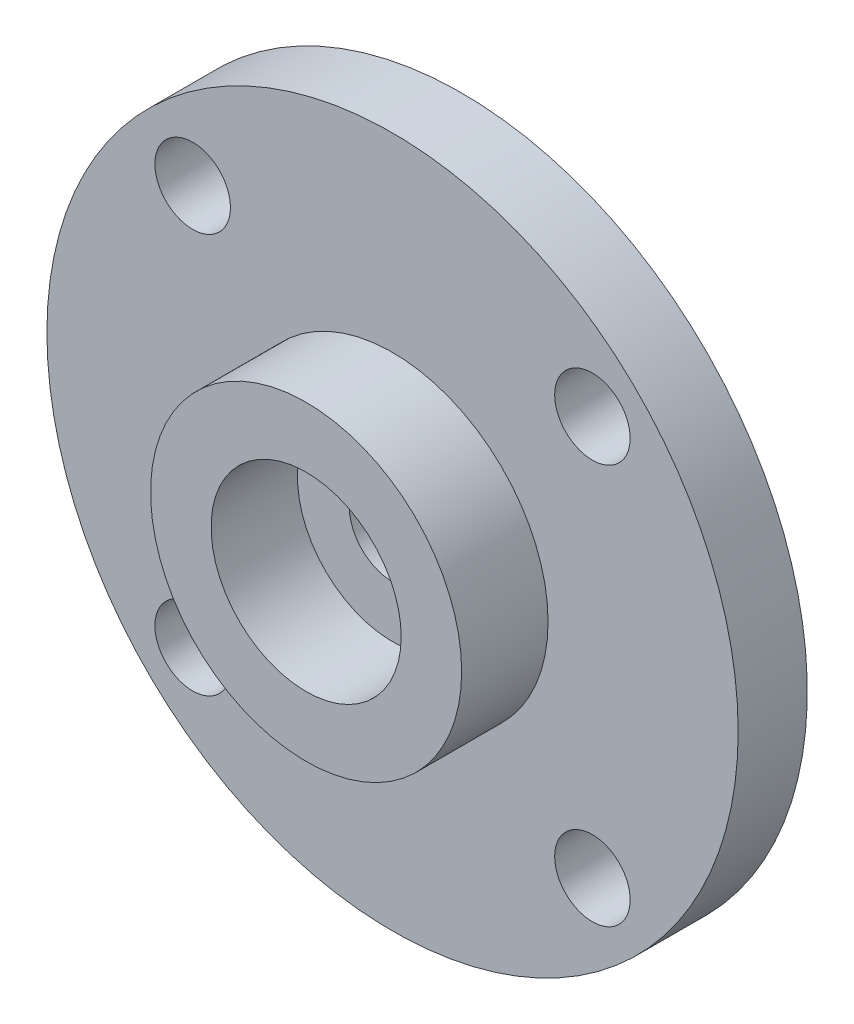
ISO-10303-21;
HEADER;
FILE_DESCRIPTION(('STEP AP214'),'2;1');
FILE_NAME('part.step','',(''),(''),'','','');
FILE_SCHEMA(('AUTOMOTIVE_DESIGN { 1 0 10303 214 1 1 1 1 }'));
ENDSEC;
DATA;
#1=APPLICATION_CONTEXT('core data for automotive mechanical design processes');
#2=APPLICATION_PROTOCOL_DEFINITION('international standard','automotive_design',2000,#1);
#3=PRODUCT_CONTEXT('',#1,'mechanical');
#4=PRODUCT('Part','Part','',(#3));
#5=PRODUCT_RELATED_PRODUCT_CATEGORY('part','',(#4));
#6=PRODUCT_DEFINITION_FORMATION('','',#4);
#7=PRODUCT_DEFINITION_CONTEXT('part definition',#1,'design');
#8=PRODUCT_DEFINITION('design','',#6,#7);
#9=PRODUCT_DEFINITION_SHAPE('','',#8);
#10=(LENGTH_UNIT() NAMED_UNIT(*) SI_UNIT(.MILLI.,.METRE.));
#11=(NAMED_UNIT(*) PLANE_ANGLE_UNIT() SI_UNIT($,.RADIAN.));
#12=(NAMED_UNIT(*) SI_UNIT($,.STERADIAN.) SOLID_ANGLE_UNIT());
#13=UNCERTAINTY_MEASURE_WITH_UNIT(LENGTH_MEASURE(1.E-05),#10,'distance_accuracy_value','');
#14=(GEOMETRIC_REPRESENTATION_CONTEXT(3) GLOBAL_UNCERTAINTY_ASSIGNED_CONTEXT((#13)) GLOBAL_UNIT_ASSIGNED_CONTEXT((#10,
#11,#12)) REPRESENTATION_CONTEXT('',''));
#15=CARTESIAN_POINT('',(0.,0.,0.));
#16=DIRECTION('',(0.,0.,1.));
#17=DIRECTION('',(1.,0.,0.));
#18=AXIS2_PLACEMENT_3D('',#15,#16,#17);
#19=CARTESIAN_POINT('',(0.,0.,0.));
#20=DIRECTION('',(0.,0.,1.));
#21=DIRECTION('',(1.,0.,0.));
#22=AXIS2_PLACEMENT_3D('',#19,#20,#21);
#23=PLANE('',#22);
#24=CARTESIAN_POINT('',(0.,0.,0.));
#25=DIRECTION('',(0.,0.,1.));
#26=DIRECTION('',(-1.,0.,0.));
#27=AXIS2_PLACEMENT_3D('',#24,#25,#26);
#28=CIRCLE('',#27,3.75);
#29=CARTESIAN_POINT('',(-3.75,0.,0.));
#30=VERTEX_POINT('',#29);
#31=EDGE_CURVE('E122',#30,#30,#28,.T.);
#32=ORIENTED_EDGE('',*,*,#31,.T.);
#33=EDGE_LOOP('',(#32));
#34=FACE_BOUND('',#33,.T.);
#35=CARTESIAN_POINT('',(-5.7828,5.7828,0.));
#36=DIRECTION('',(0.,0.,1.));
#37=DIRECTION('',(1.,0.,0.));
#38=AXIS2_PLACEMENT_3D('',#35,#36,#37);
#39=CIRCLE('',#38,1.0922);
#40=CARTESIAN_POINT('',(-6.875,5.7828,0.));
#41=VERTEX_POINT('',#40);
#42=EDGE_CURVE('E114',#41,#41,#39,.T.);
#43=ORIENTED_EDGE('',*,*,#42,.T.);
#44=EDGE_LOOP('',(#43));
#45=FACE_BOUND('',#44,.T.);
#46=CARTESIAN_POINT('',(5.7828,-5.7828,0.));
#47=DIRECTION('',(0.,0.,1.));
#48=DIRECTION('',(1.,0.,0.));
#49=AXIS2_PLACEMENT_3D('',#46,#47,#48);
#50=CIRCLE('',#49,1.0922);
#51=CARTESIAN_POINT('',(4.6906,-5.7828,0.));
#52=VERTEX_POINT('',#51);
#53=EDGE_CURVE('E104',#52,#52,#50,.T.);
#54=ORIENTED_EDGE('',*,*,#53,.T.);
#55=EDGE_LOOP('',(#54));
#56=FACE_BOUND('',#55,.T.);
#57=CARTESIAN_POINT('',(-5.7828,-5.7828,0.));
#58=DIRECTION('',(0.,0.,1.));
#59=DIRECTION('',(1.,0.,0.));
#60=AXIS2_PLACEMENT_3D('',#57,#58,#59);
#61=CIRCLE('',#60,1.0922);
#62=CARTESIAN_POINT('',(-6.875,-5.7828,0.));
#63=VERTEX_POINT('',#62);
#64=EDGE_CURVE('E98',#63,#63,#61,.T.);
#65=ORIENTED_EDGE('',*,*,#64,.T.);
#66=EDGE_LOOP('',(#65));
#67=FACE_BOUND('',#66,.T.);
#68=CARTESIAN_POINT('',(5.7828,5.7828,0.));
#69=DIRECTION('',(0.,0.,1.));
#70=DIRECTION('',(1.,0.,0.));
#71=AXIS2_PLACEMENT_3D('',#68,#69,#70);
#72=CIRCLE('',#71,1.0922);
#73=CARTESIAN_POINT('',(4.6906,5.7828,0.));
#74=VERTEX_POINT('',#73);
#75=EDGE_CURVE('E106',#74,#74,#72,.T.);
#76=ORIENTED_EDGE('',*,*,#75,.T.);
#77=EDGE_LOOP('',(#76));
#78=FACE_BOUND('',#77,.T.);
#79=CARTESIAN_POINT('',(0.,0.,0.));
#80=DIRECTION('',(0.,0.,-1.));
#81=DIRECTION('',(-1.,0.,0.));
#82=AXIS2_PLACEMENT_3D('',#79,#80,#81);
#83=CIRCLE('',#82,10.);
#84=CARTESIAN_POINT('',(-10.,0.,0.));
#85=VERTEX_POINT('',#84);
#86=EDGE_CURVE('E186',#85,#85,#83,.T.);
#87=ORIENTED_EDGE('',*,*,#86,.T.);
#88=EDGE_LOOP('',(#87));
#89=FACE_BOUND('',#88,.T.);
#90=ADVANCED_FACE('F36',(#34,#45,#56,#67,#78,#89),#23,.F.);
#91=CARTESIAN_POINT('',(0.,0.,2.));
#92=DIRECTION('',(0.,0.,1.));
#93=DIRECTION('',(1.,0.,0.));
#94=AXIS2_PLACEMENT_3D('',#91,#92,#93);
#95=PLANE('',#94);
#96=CARTESIAN_POINT('',(0.,0.,2.));
#97=DIRECTION('',(0.,0.,-1.));
#98=DIRECTION('',(1.,0.,0.));
#99=AXIS2_PLACEMENT_3D('',#96,#97,#98);
#100=CIRCLE('',#99,4.5);
#101=CARTESIAN_POINT('',(4.5,0.,2.));
#102=VERTEX_POINT('',#101);
#103=EDGE_CURVE('E110',#102,#102,#100,.T.);
#104=ORIENTED_EDGE('',*,*,#103,.T.);
#105=EDGE_LOOP('',(#104));
#106=FACE_BOUND('',#105,.T.);
#107=CARTESIAN_POINT('',(-5.7828,5.7828,2.));
#108=DIRECTION('',(0.,0.,-1.));
#109=DIRECTION('',(1.,0.,0.));
#110=AXIS2_PLACEMENT_3D('',#107,#108,#109);
#111=CIRCLE('',#110,1.0922);
#112=CARTESIAN_POINT('',(-6.875,5.7828,2.));
#113=VERTEX_POINT('',#112);
#114=EDGE_CURVE('E112',#113,#113,#111,.T.);
#115=ORIENTED_EDGE('',*,*,#114,.T.);
#116=EDGE_LOOP('',(#115));
#117=FACE_BOUND('',#116,.T.);
#118=CARTESIAN_POINT('',(5.7828,-5.7828,2.));
#119=DIRECTION('',(0.,0.,-1.));
#120=DIRECTION('',(1.,0.,0.));
#121=AXIS2_PLACEMENT_3D('',#118,#119,#120);
#122=CIRCLE('',#121,1.0922);
#123=CARTESIAN_POINT('',(4.6906,-5.7828,2.));
#124=VERTEX_POINT('',#123);
#125=EDGE_CURVE('E115',#124,#124,#122,.T.);
#126=ORIENTED_EDGE('',*,*,#125,.T.);
#127=EDGE_LOOP('',(#126));
#128=FACE_BOUND('',#127,.T.);
#129=CARTESIAN_POINT('',(-5.7828,-5.7828,2.));
#130=DIRECTION('',(0.,0.,-1.));
#131=DIRECTION('',(1.,0.,0.));
#132=AXIS2_PLACEMENT_3D('',#129,#130,#131);
#133=CIRCLE('',#132,1.0922);
#134=CARTESIAN_POINT('',(-6.875,-5.7828,2.));
#135=VERTEX_POINT('',#134);
#136=EDGE_CURVE('E101',#135,#135,#133,.T.);
#137=ORIENTED_EDGE('',*,*,#136,.T.);
#138=EDGE_LOOP('',(#137));
#139=FACE_BOUND('',#138,.T.);
#140=CARTESIAN_POINT('',(5.7828,5.7828,2.));
#141=DIRECTION('',(0.,0.,-1.));
#142=DIRECTION('',(1.,0.,0.));
#143=AXIS2_PLACEMENT_3D('',#140,#141,#142);
#144=CIRCLE('',#143,1.0922);
#145=CARTESIAN_POINT('',(4.6906,5.7828,2.));
#146=VERTEX_POINT('',#145);
#147=EDGE_CURVE('E102',#146,#146,#144,.T.);
#148=ORIENTED_EDGE('',*,*,#147,.T.);
#149=EDGE_LOOP('',(#148));
#150=FACE_BOUND('',#149,.T.);
#151=CARTESIAN_POINT('',(0.,0.,2.));
#152=DIRECTION('',(0.,0.,1.));
#153=DIRECTION('',(1.,0.,0.));
#154=AXIS2_PLACEMENT_3D('',#151,#152,#153);
#155=CIRCLE('',#154,10.);
#156=CARTESIAN_POINT('',(10.,0.,2.));
#157=VERTEX_POINT('',#156);
#158=EDGE_CURVE('E40',#157,#157,#155,.T.);
#159=ORIENTED_EDGE('',*,*,#158,.T.);
#160=EDGE_LOOP('',(#159));
#161=FACE_BOUND('',#160,.T.);
#162=ADVANCED_FACE('F156',(#106,#117,#128,#139,#150,#161),#95,.T.);
#163=CARTESIAN_POINT('',(0.,0.,4.5));
#164=DIRECTION('',(0.,0.,1.));
#165=DIRECTION('',(1.,0.,0.));
#166=AXIS2_PLACEMENT_3D('',#163,#164,#165);
#167=PLANE('',#166);
#168=CARTESIAN_POINT('',(0.,0.,4.5));
#169=DIRECTION('',(0.,0.,-1.));
#170=DIRECTION('',(1.,0.,0.));
#171=AXIS2_PLACEMENT_3D('',#168,#169,#170);
#172=CIRCLE('',#171,4.5);
#173=CARTESIAN_POINT('',(4.5,0.,4.5));
#174=VERTEX_POINT('',#173);
#175=EDGE_CURVE('E11',#174,#174,#172,.T.);
#176=ORIENTED_EDGE('',*,*,#175,.F.);
#177=EDGE_LOOP('',(#176));
#178=FACE_BOUND('',#177,.T.);
#179=CARTESIAN_POINT('',(0.,0.,4.5));
#180=DIRECTION('',(0.,0.,-1.));
#181=DIRECTION('',(1.,0.,0.));
#182=AXIS2_PLACEMENT_3D('',#179,#180,#181);
#183=CIRCLE('',#182,2.75);
#184=CARTESIAN_POINT('',(2.75,0.,4.5));
#185=VERTEX_POINT('',#184);
#186=EDGE_CURVE('E46',#185,#185,#183,.T.);
#187=ORIENTED_EDGE('',*,*,#186,.T.);
#188=EDGE_LOOP('',(#187));
#189=FACE_BOUND('',#188,.T.);
#190=ADVANCED_FACE('F162',(#178,#189),#167,.T.);
#191=CARTESIAN_POINT('',(0.,0.,2.));
#192=DIRECTION('',(0.,0.,1.));
#193=DIRECTION('',(1.,0.,0.));
#194=AXIS2_PLACEMENT_3D('',#191,#192,#193);
#195=CYLINDRICAL_SURFACE('',#194,4.5);
#196=ORIENTED_EDGE('',*,*,#103,.F.);
#197=EDGE_LOOP('',(#196));
#198=FACE_BOUND('',#197,.T.);
#199=ORIENTED_EDGE('',*,*,#175,.T.);
#200=EDGE_LOOP('',(#199));
#201=FACE_BOUND('',#200,.T.);
#202=ADVANCED_FACE('F206',(#198,#201),#195,.T.);
#203=CARTESIAN_POINT('',(0.,0.,2.));
#204=DIRECTION('',(0.,0.,1.));
#205=DIRECTION('',(1.,0.,0.));
#206=AXIS2_PLACEMENT_3D('',#203,#204,#205);
#207=PLANE('',#206);
#208=CARTESIAN_POINT('',(0.,0.,2.));
#209=DIRECTION('',(0.,0.,1.));
#210=DIRECTION('',(1.,0.,0.));
#211=AXIS2_PLACEMENT_3D('',#208,#209,#210);
#212=CIRCLE('',#211,2.75);
#213=CARTESIAN_POINT('',(2.75,0.,2.));
#214=VERTEX_POINT('',#213);
#215=EDGE_CURVE('E130',#214,#214,#212,.T.);
#216=ORIENTED_EDGE('',*,*,#215,.T.);
#217=EDGE_LOOP('',(#216));
#218=FACE_BOUND('',#217,.T.);
#219=CARTESIAN_POINT('',(0.,0.,2.));
#220=DIRECTION('',(0.,0.,-1.));
#221=DIRECTION('',(1.,0.,0.));
#222=AXIS2_PLACEMENT_3D('',#219,#220,#221);
#223=CIRCLE('',#222,1.25);
#224=CARTESIAN_POINT('',(-1.25,0.,2.));
#225=VERTEX_POINT('',#224);
#226=EDGE_CURVE('E119',#225,#225,#223,.T.);
#227=ORIENTED_EDGE('',*,*,#226,.T.);
#228=EDGE_LOOP('',(#227));
#229=FACE_BOUND('',#228,.T.);
#230=ADVANCED_FACE('F209',(#218,#229),#207,.T.);
#231=CARTESIAN_POINT('',(0.,0.,4.5));
#232=DIRECTION('',(0.,0.,-1.));
#233=DIRECTION('',(1.,0.,0.));
#234=AXIS2_PLACEMENT_3D('',#231,#232,#233);
#235=CYLINDRICAL_SURFACE('',#234,2.75);
#236=ORIENTED_EDGE('',*,*,#186,.F.);
#237=EDGE_LOOP('',(#236));
#238=FACE_BOUND('',#237,.T.);
#239=ORIENTED_EDGE('',*,*,#215,.F.);
#240=EDGE_LOOP('',(#239));
#241=FACE_BOUND('',#240,.T.);
#242=ADVANCED_FACE('F200',(#238,#241),#235,.F.);
#243=CARTESIAN_POINT('',(0.,0.,0.));
#244=DIRECTION('',(0.,0.,1.));
#245=DIRECTION('',(1.,0.,0.));
#246=AXIS2_PLACEMENT_3D('',#243,#244,#245);
#247=PLANE('',#246);
#248=CARTESIAN_POINT('',(0.,0.,0.));
#249=DIRECTION('',(0.,0.,-1.));
#250=DIRECTION('',(-1.,0.,0.));
#251=AXIS2_PLACEMENT_3D('',#248,#249,#250);
#252=CIRCLE('',#251,3.);
#253=CARTESIAN_POINT('',(-3.,0.,0.));
#254=VERTEX_POINT('',#253);
#255=EDGE_CURVE('E128',#254,#254,#252,.T.);
#256=ORIENTED_EDGE('',*,*,#255,.T.);
#257=EDGE_LOOP('',(#256));
#258=FACE_BOUND('',#257,.T.);
#259=CARTESIAN_POINT('',(0.,0.,0.));
#260=DIRECTION('',(0.,0.,1.));
#261=DIRECTION('',(1.,0.,0.));
#262=AXIS2_PLACEMENT_3D('',#259,#260,#261);
#263=CIRCLE('',#262,1.25);
#264=CARTESIAN_POINT('',(-1.25,0.,0.));
#265=VERTEX_POINT('',#264);
#266=EDGE_CURVE('E117',#265,#265,#263,.T.);
#267=ORIENTED_EDGE('',*,*,#266,.T.);
#268=EDGE_LOOP('',(#267));
#269=FACE_BOUND('',#268,.T.);
#270=ADVANCED_FACE('F38',(#258,#269),#247,.F.);
#271=CARTESIAN_POINT('',(0.,0.,-0.5));
#272=DIRECTION('',(0.,0.,-1.));
#273=DIRECTION('',(0.,-1.,0.));
#274=AXIS2_PLACEMENT_3D('',#271,#272,#273);
#275=PLANE('',#274);
#276=CARTESIAN_POINT('',(0.,0.,-0.5));
#277=DIRECTION('',(0.,0.,1.));
#278=DIRECTION('',(-1.,0.,0.));
#279=AXIS2_PLACEMENT_3D('',#276,#277,#278);
#280=CIRCLE('',#279,3.75);
#281=CARTESIAN_POINT('',(-3.75,0.,-0.5));
#282=VERTEX_POINT('',#281);
#283=EDGE_CURVE('E118',#282,#282,#280,.T.);
#284=ORIENTED_EDGE('',*,*,#283,.F.);
#285=EDGE_LOOP('',(#284));
#286=FACE_BOUND('',#285,.T.);
#287=CARTESIAN_POINT('',(0.,0.,-0.5));
#288=DIRECTION('',(0.,0.,-1.));
#289=DIRECTION('',(-1.,0.,0.));
#290=AXIS2_PLACEMENT_3D('',#287,#288,#289);
#291=CIRCLE('',#290,3.);
#292=CARTESIAN_POINT('',(-3.,0.,-0.5));
#293=VERTEX_POINT('',#292);
#294=EDGE_CURVE('E127',#293,#293,#291,.T.);
#295=ORIENTED_EDGE('',*,*,#294,.F.);
#296=EDGE_LOOP('',(#295));
#297=FACE_BOUND('',#296,.T.);
#298=ADVANCED_FACE('F191',(#286,#297),#275,.T.);
#299=CARTESIAN_POINT('',(0.,0.,0.));
#300=DIRECTION('',(0.,0.,-1.));
#301=DIRECTION('',(-1.,0.,0.));
#302=AXIS2_PLACEMENT_3D('',#299,#300,#301);
#303=CYLINDRICAL_SURFACE('',#302,3.);
#304=ORIENTED_EDGE('',*,*,#255,.F.);
#305=EDGE_LOOP('',(#304));
#306=FACE_BOUND('',#305,.T.);
#307=ORIENTED_EDGE('',*,*,#294,.T.);
#308=EDGE_LOOP('',(#307));
#309=FACE_BOUND('',#308,.T.);
#310=ADVANCED_FACE('F167',(#306,#309),#303,.F.);
#311=CARTESIAN_POINT('',(0.,0.,0.));
#312=DIRECTION('',(0.,0.,-1.));
#313=DIRECTION('',(-1.,0.,0.));
#314=AXIS2_PLACEMENT_3D('',#311,#312,#313);
#315=CYLINDRICAL_SURFACE('',#314,3.75);
#316=ORIENTED_EDGE('',*,*,#31,.F.);
#317=EDGE_LOOP('',(#316));
#318=FACE_BOUND('',#317,.T.);
#319=ORIENTED_EDGE('',*,*,#283,.T.);
#320=EDGE_LOOP('',(#319));
#321=FACE_BOUND('',#320,.T.);
#322=ADVANCED_FACE('F150',(#318,#321),#315,.T.);
#323=CARTESIAN_POINT('',(0.,0.,-34.3074335968169));
#324=DIRECTION('',(0.,0.,1.));
#325=DIRECTION('',(1.,0.,0.));
#326=AXIS2_PLACEMENT_3D('',#323,#324,#325);
#327=CYLINDRICAL_SURFACE('',#326,1.25);
#328=ORIENTED_EDGE('',*,*,#266,.F.);
#329=EDGE_LOOP('',(#328));
#330=FACE_BOUND('',#329,.T.);
#331=ORIENTED_EDGE('',*,*,#226,.F.);
#332=EDGE_LOOP('',(#331));
#333=FACE_BOUND('',#332,.T.);
#334=ADVANCED_FACE('F140',(#330,#333),#327,.F.);
#335=CARTESIAN_POINT('',(-5.7828,5.7828,-32.3074335968169));
#336=DIRECTION('',(0.,0.,1.));
#337=DIRECTION('',(1.,0.,0.));
#338=AXIS2_PLACEMENT_3D('',#335,#336,#337);
#339=CYLINDRICAL_SURFACE('',#338,1.0922);
#340=ORIENTED_EDGE('',*,*,#114,.F.);
#341=EDGE_LOOP('',(#340));
#342=FACE_BOUND('',#341,.T.);
#343=ORIENTED_EDGE('',*,*,#42,.F.);
#344=EDGE_LOOP('',(#343));
#345=FACE_BOUND('',#344,.T.);
#346=ADVANCED_FACE('F137',(#342,#345),#339,.F.);
#347=CARTESIAN_POINT('',(5.7828,-5.7828,-32.3074335968169));
#348=DIRECTION('',(0.,0.,1.));
#349=DIRECTION('',(1.,0.,0.));
#350=AXIS2_PLACEMENT_3D('',#347,#348,#349);
#351=CYLINDRICAL_SURFACE('',#350,1.0922);
#352=ORIENTED_EDGE('',*,*,#125,.F.);
#353=EDGE_LOOP('',(#352));
#354=FACE_BOUND('',#353,.T.);
#355=ORIENTED_EDGE('',*,*,#53,.F.);
#356=EDGE_LOOP('',(#355));
#357=FACE_BOUND('',#356,.T.);
#358=ADVANCED_FACE('F139',(#354,#357),#351,.F.);
#359=CARTESIAN_POINT('',(-5.7828,-5.7828,-32.3074335968169));
#360=DIRECTION('',(0.,0.,1.));
#361=DIRECTION('',(1.,0.,0.));
#362=AXIS2_PLACEMENT_3D('',#359,#360,#361);
#363=CYLINDRICAL_SURFACE('',#362,1.0922);
#364=ORIENTED_EDGE('',*,*,#136,.F.);
#365=EDGE_LOOP('',(#364));
#366=FACE_BOUND('',#365,.T.);
#367=ORIENTED_EDGE('',*,*,#64,.F.);
#368=EDGE_LOOP('',(#367));
#369=FACE_BOUND('',#368,.T.);
#370=ADVANCED_FACE('F147',(#366,#369),#363,.F.);
#371=CARTESIAN_POINT('',(5.7828,5.7828,-32.3074335968169));
#372=DIRECTION('',(0.,0.,1.));
#373=DIRECTION('',(1.,0.,0.));
#374=AXIS2_PLACEMENT_3D('',#371,#372,#373);
#375=CYLINDRICAL_SURFACE('',#374,1.0922);
#376=ORIENTED_EDGE('',*,*,#147,.F.);
#377=EDGE_LOOP('',(#376));
#378=FACE_BOUND('',#377,.T.);
#379=ORIENTED_EDGE('',*,*,#75,.F.);
#380=EDGE_LOOP('',(#379));
#381=FACE_BOUND('',#380,.T.);
#382=ADVANCED_FACE('F169',(#378,#381),#375,.F.);
#383=CARTESIAN_POINT('',(0.,0.,10.));
#384=DIRECTION('',(0.,0.,-1.));
#385=DIRECTION('',(-1.,0.,0.));
#386=AXIS2_PLACEMENT_3D('',#383,#384,#385);
#387=CYLINDRICAL_SURFACE('',#386,10.);
#388=ORIENTED_EDGE('',*,*,#158,.F.);
#389=EDGE_LOOP('',(#388));
#390=FACE_BOUND('',#389,.T.);
#391=ORIENTED_EDGE('',*,*,#86,.F.);
#392=EDGE_LOOP('',(#391));
#393=FACE_BOUND('',#392,.T.);
#394=ADVANCED_FACE('F171',(#390,#393),#387,.T.);
#395=CLOSED_SHELL('',(#90,#162,#190,#202,#230,#242,#270,#298,#310,#322,#334,#346,#358,#370,#382,#394));
#396=MANIFOLD_SOLID_BREP('B2',#395);
#397=ADVANCED_BREP_SHAPE_REPRESENTATION('',(#18,#396),#14);
#398=SHAPE_DEFINITION_REPRESENTATION(#9,#397);
ENDSEC;
END-ISO-10303-21;
